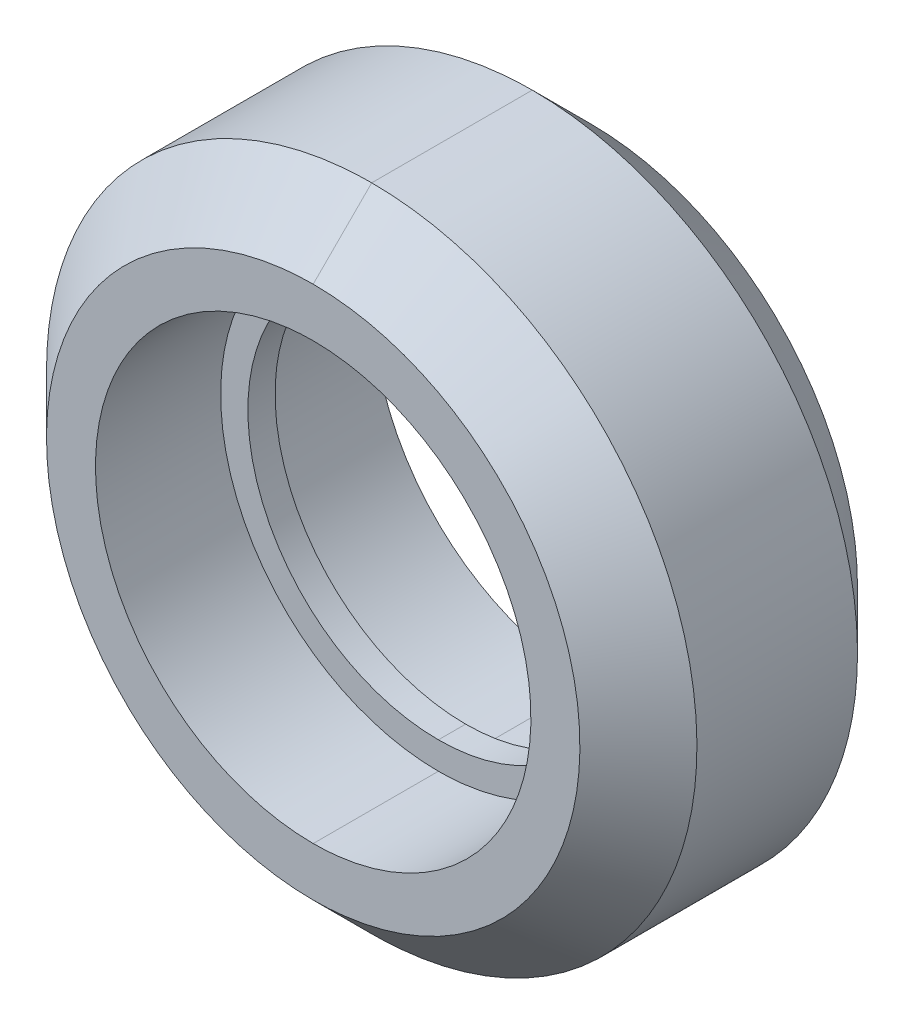
ISO-10303-21;
HEADER;
FILE_DESCRIPTION(('STEP AP214'),'2;1');
FILE_NAME('part.step','',(''),(''),'','','');
FILE_SCHEMA(('AUTOMOTIVE_DESIGN { 1 0 10303 214 1 1 1 1 }'));
ENDSEC;
DATA;
#1=APPLICATION_CONTEXT('core data for automotive mechanical design processes');
#2=APPLICATION_PROTOCOL_DEFINITION('international standard','automotive_design',2000,#1);
#3=PRODUCT_CONTEXT('',#1,'mechanical');
#4=PRODUCT('Part','Part','',(#3));
#5=PRODUCT_RELATED_PRODUCT_CATEGORY('part','',(#4));
#6=PRODUCT_DEFINITION_FORMATION('','',#4);
#7=PRODUCT_DEFINITION_CONTEXT('part definition',#1,'design');
#8=PRODUCT_DEFINITION('design','',#6,#7);
#9=PRODUCT_DEFINITION_SHAPE('','',#8);
#10=(LENGTH_UNIT() NAMED_UNIT(*) SI_UNIT(.MILLI.,.METRE.));
#11=(NAMED_UNIT(*) PLANE_ANGLE_UNIT() SI_UNIT($,.RADIAN.));
#12=(NAMED_UNIT(*) SI_UNIT($,.STERADIAN.) SOLID_ANGLE_UNIT());
#13=UNCERTAINTY_MEASURE_WITH_UNIT(LENGTH_MEASURE(1.E-05),#10,'distance_accuracy_value','');
#14=(GEOMETRIC_REPRESENTATION_CONTEXT(3) GLOBAL_UNCERTAINTY_ASSIGNED_CONTEXT((#13)) GLOBAL_UNIT_ASSIGNED_CONTEXT((#10,
#11,#12)) REPRESENTATION_CONTEXT('',''));
#15=CARTESIAN_POINT('',(0.,0.,0.));
#16=DIRECTION('',(0.,0.,1.));
#17=DIRECTION('',(1.,0.,0.));
#18=AXIS2_PLACEMENT_3D('',#15,#16,#17);
#19=CARTESIAN_POINT('',(209.215281719252,-415.287341556894,254.981305856301));
#20=CARTESIAN_POINT('',(217.215281719252,-415.287341556894,254.981305856301));
#21=CARTESIAN_POINT('',(217.215281719252,-423.287341556894,254.981305856301));
#22=CARTESIAN_POINT('',(217.215281719252,-431.287341556894,254.981305856301));
#23=CARTESIAN_POINT('',(209.215281719252,-431.287341556894,254.981305856301));
#24=CARTESIAN_POINT('',(209.215281719252,-415.287341556894,250.381305856301));
#25=CARTESIAN_POINT('',(217.215281719252,-415.287341556894,250.381305856301));
#26=CARTESIAN_POINT('',(217.215281719252,-423.287341556894,250.381305856301));
#27=CARTESIAN_POINT('',(217.215281719252,-431.287341556894,250.381305856301));
#28=CARTESIAN_POINT('',(209.215281719252,-431.287341556894,250.381305856301));
#29=(BOUNDED_SURFACE() B_SPLINE_SURFACE(1,2,((#19,#20,#21,#22,#23),(#24,#25,#26,#27,#28)),
.UNSPECIFIED.,.F.,.F.,.F.) B_SPLINE_SURFACE_WITH_KNOTS((2,2),(3,2,3),(-5.1,-0.5),
(1.5707963267949,3.14159265358979,4.71238898038469),
.UNSPECIFIED.) GEOMETRIC_REPRESENTATION_ITEM() RATIONAL_B_SPLINE_SURFACE(((1.,0.707106781186548,
1.,0.707106781186548,1.),(1.,0.707106781186548,1.,0.707106781186548,1.))) REPRESENTATION_ITEM('') SURFACE());
#30=CARTESIAN_POINT('',(209.215281719252,-431.287341556894,254.981305856301));
#31=CARTESIAN_POINT('',(209.215281719252,-431.287341556894,250.381305856301));
#32=(BOUNDED_CURVE() B_SPLINE_CURVE(1,(#30,#31),.UNSPECIFIED.,.F.,
.F.) B_SPLINE_CURVE_WITH_KNOTS((2,2),(0.,4.6),
.UNSPECIFIED.) CURVE() GEOMETRIC_REPRESENTATION_ITEM() RATIONAL_B_SPLINE_CURVE((1.,1.)) REPRESENTATION_ITEM(''));
#33=CARTESIAN_POINT('',(209.215281719252,-431.287341556894,254.981305856301));
#34=VERTEX_POINT('',#33);
#35=CARTESIAN_POINT('',(209.215281719252,-431.287341556894,250.381305856301));
#36=VERTEX_POINT('',#35);
#37=EDGE_CURVE('E74',#34,#36,#32,.T.);
#38=CARTESIAN_POINT('',(209.215281719252,-415.287341556894,254.981305856301));
#39=CARTESIAN_POINT('',(217.215281719252,-415.287341556894,254.981305856301));
#40=CARTESIAN_POINT('',(217.215281719252,-423.287341556894,254.981305856301));
#41=CARTESIAN_POINT('',(217.215281719252,-431.287341556894,254.981305856301));
#42=CARTESIAN_POINT('',(209.215281719252,-431.287341556894,254.981305856301));
#43=(BOUNDED_CURVE() B_SPLINE_CURVE(2,(#38,#39,#40,#41,#42),.UNSPECIFIED.,.F.,
.F.) B_SPLINE_CURVE_WITH_KNOTS((3,2,3),(0.,12.5663706143592,25.1327412287183),
.UNSPECIFIED.) CURVE() GEOMETRIC_REPRESENTATION_ITEM() RATIONAL_B_SPLINE_CURVE((1.,
0.707106781186548,1.,0.707106781186548,1.)) REPRESENTATION_ITEM(''));
#44=CARTESIAN_POINT('',(209.215281719252,-415.287341556894,254.981305856301));
#45=VERTEX_POINT('',#44);
#46=EDGE_CURVE('E289',#45,#34,#43,.T.);
#47=CARTESIAN_POINT('',(209.215281719252,-415.287341556894,254.981305856301));
#48=CARTESIAN_POINT('',(209.215281719252,-415.287341556894,250.381305856301));
#49=(BOUNDED_CURVE() B_SPLINE_CURVE(1,(#47,#48),.UNSPECIFIED.,.F.,
.F.) B_SPLINE_CURVE_WITH_KNOTS((2,2),(0.,4.6),
.UNSPECIFIED.) CURVE() GEOMETRIC_REPRESENTATION_ITEM() RATIONAL_B_SPLINE_CURVE((1.,1.)) REPRESENTATION_ITEM(''));
#50=CARTESIAN_POINT('',(209.215281719252,-415.287341556894,250.381305856301));
#51=VERTEX_POINT('',#50);
#52=EDGE_CURVE('E83',#45,#51,#49,.T.);
#53=CARTESIAN_POINT('',(209.215281719252,-415.287341556894,250.381305856301));
#54=CARTESIAN_POINT('',(217.215281719252,-415.287341556894,250.381305856301));
#55=CARTESIAN_POINT('',(217.215281719252,-423.287341556894,250.381305856301));
#56=CARTESIAN_POINT('',(217.215281719252,-431.287341556894,250.381305856301));
#57=CARTESIAN_POINT('',(209.215281719252,-431.287341556894,250.381305856301));
#58=(BOUNDED_CURVE() B_SPLINE_CURVE(2,(#53,#54,#55,#56,#57),.UNSPECIFIED.,.F.,
.F.) B_SPLINE_CURVE_WITH_KNOTS((3,2,3),(0.,12.5663706143592,25.1327412287183),
.UNSPECIFIED.) CURVE() GEOMETRIC_REPRESENTATION_ITEM() RATIONAL_B_SPLINE_CURVE((1.,
0.707106781186548,1.,0.707106781186548,1.)) REPRESENTATION_ITEM(''));
#59=EDGE_CURVE('E162',#51,#36,#58,.T.);
#60=ORIENTED_EDGE('',*,*,#37,.F.);
#61=ORIENTED_EDGE('',*,*,#46,.F.);
#62=ORIENTED_EDGE('',*,*,#52,.T.);
#63=ORIENTED_EDGE('',*,*,#59,.T.);
#64=EDGE_LOOP('',(#60,#61,#62,#63));
#65=FACE_BOUND('',#64,.T.);
#66=ADVANCED_FACE('F51',(#65),#29,.T.);
#67=CARTESIAN_POINT('',(209.215281719252,-413.487341556894,254.981305856301));
#68=CARTESIAN_POINT('',(209.215281719252,-411.337341556894,252.831305856301));
#69=CARTESIAN_POINT('',(219.015281719252,-413.487341556894,254.981305856301));
#70=CARTESIAN_POINT('',(221.165281719252,-411.337341556894,252.831305856301));
#71=CARTESIAN_POINT('',(219.015281719252,-423.287341556894,254.981305856301));
#72=CARTESIAN_POINT('',(221.165281719252,-423.287341556894,252.831305856301));
#73=CARTESIAN_POINT('',(219.015281719252,-433.087341556894,254.981305856301));
#74=CARTESIAN_POINT('',(221.165281719252,-435.237341556894,252.831305856301));
#75=CARTESIAN_POINT('',(209.215281719252,-433.087341556894,254.981305856301));
#76=CARTESIAN_POINT('',(209.215281719252,-435.237341556894,252.831305856301));
#77=(BOUNDED_SURFACE() B_SPLINE_SURFACE(2,1,((#67,#68),(#69,#70),(#71,#72),(#73,#74),(#75,#76)),
.UNSPECIFIED.,.F.,.F.,.F.) B_SPLINE_SURFACE_WITH_KNOTS((3,2,3),(2,2),(1.5707963267949,
3.14159265358979,4.71238898038469),(-3.04055915910215,0.),
.UNSPECIFIED.) GEOMETRIC_REPRESENTATION_ITEM() RATIONAL_B_SPLINE_SURFACE(((1.,1.),
(0.707106781186548,0.707106781186548),(1.,1.),(0.707106781186548,0.707106781186548),(1.,1.))) REPRESENTATION_ITEM('') SURFACE());
#78=CARTESIAN_POINT('',(209.215281719252,-433.087341556894,254.981305856301));
#79=CARTESIAN_POINT('',(209.215281719252,-435.237341556894,252.831305856301));
#80=(BOUNDED_CURVE() B_SPLINE_CURVE(1,(#78,#79),.UNSPECIFIED.,.F.,
.F.) B_SPLINE_CURVE_WITH_KNOTS((2,2),(0.,3.04055915910214),
.UNSPECIFIED.) CURVE() GEOMETRIC_REPRESENTATION_ITEM() RATIONAL_B_SPLINE_CURVE((1.,1.)) REPRESENTATION_ITEM(''));
#81=CARTESIAN_POINT('',(209.215281719252,-433.087341556894,254.981305856301));
#82=VERTEX_POINT('',#81);
#83=CARTESIAN_POINT('',(209.215281719252,-435.237341556894,252.831305856301));
#84=VERTEX_POINT('',#83);
#85=EDGE_CURVE('E377',#82,#84,#80,.T.);
#86=CARTESIAN_POINT('',(209.215281719252,-411.337341556894,252.831305856301));
#87=CARTESIAN_POINT('',(221.165281719252,-411.337341556894,252.831305856301));
#88=CARTESIAN_POINT('',(221.165281719252,-423.287341556894,252.831305856301));
#89=CARTESIAN_POINT('',(221.165281719252,-435.237341556894,252.831305856301));
#90=CARTESIAN_POINT('',(209.215281719252,-435.237341556894,252.831305856301));
#91=(BOUNDED_CURVE() B_SPLINE_CURVE(2,(#86,#87,#88,#89,#90),.UNSPECIFIED.,.F.,
.F.) B_SPLINE_CURVE_WITH_KNOTS((3,2,3),(0.,18.771016105199,37.542032210398),
.UNSPECIFIED.) CURVE() GEOMETRIC_REPRESENTATION_ITEM() RATIONAL_B_SPLINE_CURVE((1.,
0.707106781186548,1.,0.707106781186548,1.)) REPRESENTATION_ITEM(''));
#92=CARTESIAN_POINT('',(209.215281719252,-411.337341556894,252.831305856301));
#93=VERTEX_POINT('',#92);
#94=EDGE_CURVE('E11',#93,#84,#91,.T.);
#95=CARTESIAN_POINT('',(209.215281719252,-413.487341556894,254.981305856301));
#96=CARTESIAN_POINT('',(209.215281719252,-411.337341556894,252.831305856301));
#97=(BOUNDED_CURVE() B_SPLINE_CURVE(1,(#95,#96),.UNSPECIFIED.,.F.,
.F.) B_SPLINE_CURVE_WITH_KNOTS((2,2),(0.,3.04055915910214),
.UNSPECIFIED.) CURVE() GEOMETRIC_REPRESENTATION_ITEM() RATIONAL_B_SPLINE_CURVE((1.,1.)) REPRESENTATION_ITEM(''));
#98=CARTESIAN_POINT('',(209.215281719252,-413.487341556894,254.981305856301));
#99=VERTEX_POINT('',#98);
#100=EDGE_CURVE('E290',#99,#93,#97,.T.);
#101=CARTESIAN_POINT('',(209.215281719252,-413.487341556894,254.981305856301));
#102=CARTESIAN_POINT('',(219.015281719252,-413.487341556894,254.981305856301));
#103=CARTESIAN_POINT('',(219.015281719252,-423.287341556894,254.981305856301));
#104=CARTESIAN_POINT('',(219.015281719252,-433.087341556894,254.981305856301));
#105=CARTESIAN_POINT('',(209.215281719252,-433.087341556894,254.981305856301));
#106=(BOUNDED_CURVE() B_SPLINE_CURVE(2,(#101,#102,#103,#104,#105),.UNSPECIFIED.,.F.,
.F.) B_SPLINE_CURVE_WITH_KNOTS((3,2,3),(0.,15.39380400259,30.78760800518),
.UNSPECIFIED.) CURVE() GEOMETRIC_REPRESENTATION_ITEM() RATIONAL_B_SPLINE_CURVE((1.,
0.707106781186548,1.,0.707106781186548,1.)) REPRESENTATION_ITEM(''));
#107=EDGE_CURVE('E281',#99,#82,#106,.T.);
#108=ORIENTED_EDGE('',*,*,#85,.T.);
#109=ORIENTED_EDGE('',*,*,#94,.F.);
#110=ORIENTED_EDGE('',*,*,#100,.F.);
#111=ORIENTED_EDGE('',*,*,#107,.T.);
#112=EDGE_LOOP('',(#108,#109,#110,#111));
#113=FACE_BOUND('',#112,.T.);
#114=ADVANCED_FACE('F543',(#113),#77,.T.);
#115=CARTESIAN_POINT('',(209.215281719252,-411.337341556894,252.831305856301));
#116=CARTESIAN_POINT('',(209.215281719252,-411.337341556894,246.931305856301));
#117=CARTESIAN_POINT('',(221.165281719252,-411.337341556894,252.831305856301));
#118=CARTESIAN_POINT('',(221.165281719252,-411.337341556894,246.931305856301));
#119=CARTESIAN_POINT('',(221.165281719252,-423.287341556894,252.831305856301));
#120=CARTESIAN_POINT('',(221.165281719252,-423.287341556894,246.931305856301));
#121=CARTESIAN_POINT('',(221.165281719252,-435.237341556894,252.831305856301));
#122=CARTESIAN_POINT('',(221.165281719252,-435.237341556894,246.931305856301));
#123=CARTESIAN_POINT('',(209.215281719252,-435.237341556894,252.831305856301));
#124=CARTESIAN_POINT('',(209.215281719252,-435.237341556894,246.931305856301));
#125=(BOUNDED_SURFACE() B_SPLINE_SURFACE(2,1,((#115,#116),(#117,#118),(#119,#120),(#121,#122),
(#123,#124)),.UNSPECIFIED.,.F.,.F.,.F.) B_SPLINE_SURFACE_WITH_KNOTS((3,2,3),(2,2),
(1.5707963267949,3.14159265358979,4.71238898038469),(-2.95,2.95),
.UNSPECIFIED.) GEOMETRIC_REPRESENTATION_ITEM() RATIONAL_B_SPLINE_SURFACE(((1.,1.),
(0.707106781186547,0.707106781186547),(1.,1.),(0.707106781186547,0.707106781186547),(1.,1.))) REPRESENTATION_ITEM('') SURFACE());
#126=CARTESIAN_POINT('',(209.215281719252,-435.237341556894,252.831305856301));
#127=CARTESIAN_POINT('',(209.215281719252,-435.237341556894,246.931305856301));
#128=(BOUNDED_CURVE() B_SPLINE_CURVE(1,(#126,#127),.UNSPECIFIED.,.F.,
.F.) B_SPLINE_CURVE_WITH_KNOTS((2,2),(0.,5.9),
.UNSPECIFIED.) CURVE() GEOMETRIC_REPRESENTATION_ITEM() RATIONAL_B_SPLINE_CURVE((1.,1.)) REPRESENTATION_ITEM(''));
#129=CARTESIAN_POINT('',(209.215281719252,-435.237341556894,246.931305856301));
#130=VERTEX_POINT('',#129);
#131=EDGE_CURVE('E350',#84,#130,#128,.T.);
#132=CARTESIAN_POINT('',(209.215281719252,-411.337341556894,246.931305856301));
#133=CARTESIAN_POINT('',(221.165281719252,-411.337341556894,246.931305856301));
#134=CARTESIAN_POINT('',(221.165281719252,-423.287341556894,246.931305856301));
#135=CARTESIAN_POINT('',(221.165281719252,-435.237341556894,246.931305856301));
#136=CARTESIAN_POINT('',(209.215281719252,-435.237341556894,246.931305856301));
#137=(BOUNDED_CURVE() B_SPLINE_CURVE(2,(#132,#133,#134,#135,#136),.UNSPECIFIED.,.F.,
.F.) B_SPLINE_CURVE_WITH_KNOTS((3,2,3),(0.,18.771016105199,37.5420322103981),
.UNSPECIFIED.) CURVE() GEOMETRIC_REPRESENTATION_ITEM() RATIONAL_B_SPLINE_CURVE((1.,
0.707106781186547,1.,0.707106781186547,1.)) REPRESENTATION_ITEM(''));
#138=CARTESIAN_POINT('',(209.215281719252,-411.337341556894,246.931305856301));
#139=VERTEX_POINT('',#138);
#140=EDGE_CURVE('E63',#139,#130,#137,.T.);
#141=CARTESIAN_POINT('',(209.215281719252,-411.337341556894,252.831305856301));
#142=CARTESIAN_POINT('',(209.215281719252,-411.337341556894,246.931305856301));
#143=(BOUNDED_CURVE() B_SPLINE_CURVE(1,(#141,#142),.UNSPECIFIED.,.F.,
.F.) B_SPLINE_CURVE_WITH_KNOTS((2,2),(0.,5.9),
.UNSPECIFIED.) CURVE() GEOMETRIC_REPRESENTATION_ITEM() RATIONAL_B_SPLINE_CURVE((1.,1.)) REPRESENTATION_ITEM(''));
#144=EDGE_CURVE('E368',#93,#139,#143,.T.);
#145=ORIENTED_EDGE('',*,*,#131,.T.);
#146=ORIENTED_EDGE('',*,*,#140,.F.);
#147=ORIENTED_EDGE('',*,*,#144,.F.);
#148=ORIENTED_EDGE('',*,*,#94,.T.);
#149=EDGE_LOOP('',(#145,#146,#147,#148));
#150=FACE_BOUND('',#149,.T.);
#151=ADVANCED_FACE('F548',(#150),#125,.T.);
#152=CARTESIAN_POINT('',(209.215281719252,-433.087341556894,244.781305856301));
#153=CARTESIAN_POINT('',(209.215281719252,-435.237341556894,246.931305856301));
#154=CARTESIAN_POINT('',(219.015281719252,-433.087341556894,244.781305856301));
#155=CARTESIAN_POINT('',(221.165281719252,-435.237341556894,246.931305856301));
#156=CARTESIAN_POINT('',(219.015281719252,-423.287341556894,244.781305856301));
#157=CARTESIAN_POINT('',(221.165281719252,-423.287341556894,246.931305856301));
#158=CARTESIAN_POINT('',(219.015281719252,-413.487341556894,244.781305856301));
#159=CARTESIAN_POINT('',(221.165281719252,-411.337341556894,246.931305856301));
#160=CARTESIAN_POINT('',(209.215281719252,-413.487341556894,244.781305856301));
#161=CARTESIAN_POINT('',(209.215281719252,-411.337341556894,246.931305856301));
#162=(BOUNDED_SURFACE() B_SPLINE_SURFACE(2,1,((#152,#153),(#154,#155),(#156,#157),(#158,#159),
(#160,#161)),.UNSPECIFIED.,.F.,.F.,.F.) B_SPLINE_SURFACE_WITH_KNOTS((3,2,3),(2,2),
(1.5707963267949,3.14159265358979,4.71238898038469),(0.,3.04055915910214),
.UNSPECIFIED.) GEOMETRIC_REPRESENTATION_ITEM() RATIONAL_B_SPLINE_SURFACE(((1.,1.),
(0.707106781186548,0.707106781186548),(1.,1.),(0.707106781186548,0.707106781186548),(1.,1.))) REPRESENTATION_ITEM('') SURFACE());
#163=CARTESIAN_POINT('',(209.215281719252,-413.487341556894,244.781305856301));
#164=CARTESIAN_POINT('',(209.215281719252,-411.337341556894,246.931305856301));
#165=(BOUNDED_CURVE() B_SPLINE_CURVE(1,(#163,#164),.UNSPECIFIED.,.F.,
.F.) B_SPLINE_CURVE_WITH_KNOTS((2,2),(0.,3.04055915910214),
.UNSPECIFIED.) CURVE() GEOMETRIC_REPRESENTATION_ITEM() RATIONAL_B_SPLINE_CURVE((1.,1.)) REPRESENTATION_ITEM(''));
#166=CARTESIAN_POINT('',(209.215281719252,-413.487341556894,244.781305856301));
#167=VERTEX_POINT('',#166);
#168=EDGE_CURVE('E323',#167,#139,#165,.T.);
#169=CARTESIAN_POINT('',(209.215281719252,-433.087341556894,244.781305856301));
#170=CARTESIAN_POINT('',(209.215281719252,-435.237341556894,246.931305856301));
#171=(BOUNDED_CURVE() B_SPLINE_CURVE(1,(#169,#170),.UNSPECIFIED.,.F.,
.F.) B_SPLINE_CURVE_WITH_KNOTS((2,2),(0.,3.04055915910212),
.UNSPECIFIED.) CURVE() GEOMETRIC_REPRESENTATION_ITEM() RATIONAL_B_SPLINE_CURVE((1.,1.)) REPRESENTATION_ITEM(''));
#172=CARTESIAN_POINT('',(209.215281719252,-433.087341556894,244.781305856301));
#173=VERTEX_POINT('',#172);
#174=EDGE_CURVE('E332',#173,#130,#171,.T.);
#175=CARTESIAN_POINT('',(209.215281719252,-413.487341556894,244.781305856301));
#176=CARTESIAN_POINT('',(219.015281719252,-413.487341556894,244.781305856301));
#177=CARTESIAN_POINT('',(219.015281719252,-423.287341556894,244.781305856301));
#178=CARTESIAN_POINT('',(219.015281719252,-433.087341556894,244.781305856301));
#179=CARTESIAN_POINT('',(209.215281719252,-433.087341556894,244.781305856301));
#180=(BOUNDED_CURVE() B_SPLINE_CURVE(2,(#175,#176,#177,#178,#179),.UNSPECIFIED.,.F.,
.F.) B_SPLINE_CURVE_WITH_KNOTS((3,2,3),(0.,15.39380400259,30.78760800518),
.UNSPECIFIED.) CURVE() GEOMETRIC_REPRESENTATION_ITEM() RATIONAL_B_SPLINE_CURVE((1.,
0.707106781186548,1.,0.707106781186548,1.)) REPRESENTATION_ITEM(''));
#181=EDGE_CURVE('E211',#167,#173,#180,.T.);
#182=ORIENTED_EDGE('',*,*,#168,.T.);
#183=ORIENTED_EDGE('',*,*,#140,.T.);
#184=ORIENTED_EDGE('',*,*,#174,.F.);
#185=ORIENTED_EDGE('',*,*,#181,.F.);
#186=EDGE_LOOP('',(#182,#183,#184,#185));
#187=FACE_BOUND('',#186,.T.);
#188=ADVANCED_FACE('F555',(#187),#162,.T.);
#189=CARTESIAN_POINT('',(209.215281719252,-415.287341556894,249.381305856301));
#190=CARTESIAN_POINT('',(217.215281719252,-415.287341556894,249.381305856301));
#191=CARTESIAN_POINT('',(217.215281719252,-423.287341556894,249.381305856301));
#192=CARTESIAN_POINT('',(217.215281719252,-431.287341556894,249.381305856301));
#193=CARTESIAN_POINT('',(209.215281719252,-431.287341556894,249.381305856301));
#194=CARTESIAN_POINT('',(209.215281719252,-415.287341556894,244.781305856301));
#195=CARTESIAN_POINT('',(217.215281719252,-415.287341556894,244.781305856301));
#196=CARTESIAN_POINT('',(217.215281719252,-423.287341556894,244.781305856301));
#197=CARTESIAN_POINT('',(217.215281719252,-431.287341556894,244.781305856301));
#198=CARTESIAN_POINT('',(209.215281719252,-431.287341556894,244.781305856301));
#199=(BOUNDED_SURFACE() B_SPLINE_SURFACE(1,2,((#189,#190,#191,#192,#193),(#194,#195,#196,#197,
#198)),.UNSPECIFIED.,.F.,.F.,.F.) B_SPLINE_SURFACE_WITH_KNOTS((2,2),(3,2,3),(0.5,5.1),
(1.5707963267949,3.14159265358979,4.71238898038469),
.UNSPECIFIED.) GEOMETRIC_REPRESENTATION_ITEM() RATIONAL_B_SPLINE_SURFACE(((1.,0.707106781186548,
1.,0.707106781186548,1.),(1.,0.707106781186548,1.,0.707106781186548,1.))) REPRESENTATION_ITEM('') SURFACE());
#200=CARTESIAN_POINT('',(209.215281719252,-431.287341556894,249.381305856301));
#201=CARTESIAN_POINT('',(209.215281719252,-431.287341556894,244.781305856301));
#202=(BOUNDED_CURVE() B_SPLINE_CURVE(1,(#200,#201),.UNSPECIFIED.,.F.,
.F.) B_SPLINE_CURVE_WITH_KNOTS((2,2),(0.,4.6),
.UNSPECIFIED.) CURVE() GEOMETRIC_REPRESENTATION_ITEM() RATIONAL_B_SPLINE_CURVE((1.,1.)) REPRESENTATION_ITEM(''));
#203=CARTESIAN_POINT('',(209.215281719252,-431.287341556894,249.381305856301));
#204=VERTEX_POINT('',#203);
#205=CARTESIAN_POINT('',(209.215281719252,-431.287341556894,244.781305856301));
#206=VERTEX_POINT('',#205);
#207=EDGE_CURVE('E271',#204,#206,#202,.T.);
#208=CARTESIAN_POINT('',(209.215281719252,-415.287341556894,249.381305856301));
#209=CARTESIAN_POINT('',(217.215281719252,-415.287341556894,249.381305856301));
#210=CARTESIAN_POINT('',(217.215281719252,-423.287341556894,249.381305856301));
#211=CARTESIAN_POINT('',(217.215281719252,-431.287341556894,249.381305856301));
#212=CARTESIAN_POINT('',(209.215281719252,-431.287341556894,249.381305856301));
#213=(BOUNDED_CURVE() B_SPLINE_CURVE(2,(#208,#209,#210,#211,#212),.UNSPECIFIED.,.F.,
.F.) B_SPLINE_CURVE_WITH_KNOTS((3,2,3),(0.,12.5663706143592,25.1327412287183),
.UNSPECIFIED.) CURVE() GEOMETRIC_REPRESENTATION_ITEM() RATIONAL_B_SPLINE_CURVE((1.,
0.707106781186548,1.,0.707106781186548,1.)) REPRESENTATION_ITEM(''));
#214=CARTESIAN_POINT('',(209.215281719252,-415.287341556894,249.381305856301));
#215=VERTEX_POINT('',#214);
#216=EDGE_CURVE('E238',#215,#204,#213,.T.);
#217=CARTESIAN_POINT('',(209.215281719252,-415.287341556894,249.381305856301));
#218=CARTESIAN_POINT('',(209.215281719252,-415.287341556894,244.781305856301));
#219=(BOUNDED_CURVE() B_SPLINE_CURVE(1,(#217,#218),.UNSPECIFIED.,.F.,
.F.) B_SPLINE_CURVE_WITH_KNOTS((2,2),(0.,4.6),
.UNSPECIFIED.) CURVE() GEOMETRIC_REPRESENTATION_ITEM() RATIONAL_B_SPLINE_CURVE((1.,1.)) REPRESENTATION_ITEM(''));
#220=CARTESIAN_POINT('',(209.215281719252,-415.287341556894,244.781305856301));
#221=VERTEX_POINT('',#220);
#222=EDGE_CURVE('E299',#215,#221,#219,.T.);
#223=CARTESIAN_POINT('',(209.215281719252,-415.287341556894,244.781305856301));
#224=CARTESIAN_POINT('',(217.215281719252,-415.287341556894,244.781305856301));
#225=CARTESIAN_POINT('',(217.215281719252,-423.287341556894,244.781305856301));
#226=CARTESIAN_POINT('',(217.215281719252,-431.287341556894,244.781305856301));
#227=CARTESIAN_POINT('',(209.215281719252,-431.287341556894,244.781305856301));
#228=(BOUNDED_CURVE() B_SPLINE_CURVE(2,(#223,#224,#225,#226,#227),.UNSPECIFIED.,.F.,
.F.) B_SPLINE_CURVE_WITH_KNOTS((3,2,3),(0.,12.5663706143592,25.1327412287184),
.UNSPECIFIED.) CURVE() GEOMETRIC_REPRESENTATION_ITEM() RATIONAL_B_SPLINE_CURVE((1.,
0.707106781186548,1.,0.707106781186548,1.)) REPRESENTATION_ITEM(''));
#229=EDGE_CURVE('E175',#221,#206,#228,.T.);
#230=ORIENTED_EDGE('',*,*,#207,.F.);
#231=ORIENTED_EDGE('',*,*,#216,.F.);
#232=ORIENTED_EDGE('',*,*,#222,.T.);
#233=ORIENTED_EDGE('',*,*,#229,.T.);
#234=EDGE_LOOP('',(#230,#231,#232,#233));
#235=FACE_BOUND('',#234,.T.);
#236=ADVANCED_FACE('F518',(#235),#199,.T.);
#237=CARTESIAN_POINT('',(209.215281719252,-416.287341556894,250.381305856301));
#238=CARTESIAN_POINT('',(216.215281719252,-416.287341556894,250.381305856301));
#239=CARTESIAN_POINT('',(216.215281719252,-423.287341556894,250.381305856301));
#240=CARTESIAN_POINT('',(216.215281719252,-430.287341556894,250.381305856301));
#241=CARTESIAN_POINT('',(209.215281719252,-430.287341556894,250.381305856301));
#242=CARTESIAN_POINT('',(209.215281719252,-416.287341556894,249.381305856301));
#243=CARTESIAN_POINT('',(216.215281719252,-416.287341556894,249.381305856301));
#244=CARTESIAN_POINT('',(216.215281719252,-423.287341556894,249.381305856301));
#245=CARTESIAN_POINT('',(216.215281719252,-430.287341556894,249.381305856301));
#246=CARTESIAN_POINT('',(209.215281719252,-430.287341556894,249.381305856301));
#247=(BOUNDED_SURFACE() B_SPLINE_SURFACE(1,2,((#237,#238,#239,#240,#241),(#242,#243,#244,#245,
#246)),.UNSPECIFIED.,.F.,.F.,.F.) B_SPLINE_SURFACE_WITH_KNOTS((2,2),(3,2,3),(-0.5,0.5),
(1.5707963267949,3.14159265358979,4.71238898038469),
.UNSPECIFIED.) GEOMETRIC_REPRESENTATION_ITEM() RATIONAL_B_SPLINE_SURFACE(((1.,0.707106781186548,
1.,0.707106781186548,1.),(1.,0.707106781186548,1.,0.707106781186548,1.))) REPRESENTATION_ITEM('') SURFACE());
#248=CARTESIAN_POINT('',(209.215281719252,-430.287341556894,250.381305856301));
#249=CARTESIAN_POINT('',(209.215281719252,-430.287341556894,249.381305856301));
#250=(BOUNDED_CURVE() B_SPLINE_CURVE(1,(#248,#249),.UNSPECIFIED.,.F.,
.F.) B_SPLINE_CURVE_WITH_KNOTS((2,2),(0.,1.),
.UNSPECIFIED.) CURVE() GEOMETRIC_REPRESENTATION_ITEM() RATIONAL_B_SPLINE_CURVE((1.,1.)) REPRESENTATION_ITEM(''));
#251=CARTESIAN_POINT('',(209.215281719252,-430.287341556894,250.381305856301));
#252=VERTEX_POINT('',#251);
#253=CARTESIAN_POINT('',(209.215281719252,-430.287341556894,249.381305856301));
#254=VERTEX_POINT('',#253);
#255=EDGE_CURVE('E201',#252,#254,#250,.T.);
#256=CARTESIAN_POINT('',(209.215281719252,-416.287341556894,250.381305856301));
#257=CARTESIAN_POINT('',(216.215281719252,-416.287341556894,250.381305856301));
#258=CARTESIAN_POINT('',(216.215281719252,-423.287341556894,250.381305856301));
#259=CARTESIAN_POINT('',(216.215281719252,-430.287341556894,250.381305856301));
#260=CARTESIAN_POINT('',(209.215281719252,-430.287341556894,250.381305856301));
#261=(BOUNDED_CURVE() B_SPLINE_CURVE(2,(#256,#257,#258,#259,#260),.UNSPECIFIED.,.F.,
.F.) B_SPLINE_CURVE_WITH_KNOTS((3,2,3),(0.,10.9955742875643,21.9911485751286),
.UNSPECIFIED.) CURVE() GEOMETRIC_REPRESENTATION_ITEM() RATIONAL_B_SPLINE_CURVE((1.,
0.707106781186548,1.,0.707106781186548,1.)) REPRESENTATION_ITEM(''));
#262=CARTESIAN_POINT('',(209.215281719252,-416.287341556894,250.381305856301));
#263=VERTEX_POINT('',#262);
#264=EDGE_CURVE('E165',#263,#252,#261,.T.);
#265=CARTESIAN_POINT('',(209.215281719252,-416.287341556894,250.381305856301));
#266=CARTESIAN_POINT('',(209.215281719252,-416.287341556894,249.381305856301));
#267=(BOUNDED_CURVE() B_SPLINE_CURVE(1,(#265,#266),.UNSPECIFIED.,.F.,
.F.) B_SPLINE_CURVE_WITH_KNOTS((2,2),(0.,1.),
.UNSPECIFIED.) CURVE() GEOMETRIC_REPRESENTATION_ITEM() RATIONAL_B_SPLINE_CURVE((1.,1.)) REPRESENTATION_ITEM(''));
#268=CARTESIAN_POINT('',(209.215281719252,-416.287341556894,249.381305856301));
#269=VERTEX_POINT('',#268);
#270=EDGE_CURVE('E229',#263,#269,#267,.T.);
#271=CARTESIAN_POINT('',(209.215281719252,-416.287341556894,249.381305856301));
#272=CARTESIAN_POINT('',(216.215281719252,-416.287341556894,249.381305856301));
#273=CARTESIAN_POINT('',(216.215281719252,-423.287341556894,249.381305856301));
#274=CARTESIAN_POINT('',(216.215281719252,-430.287341556894,249.381305856301));
#275=CARTESIAN_POINT('',(209.215281719252,-430.287341556894,249.381305856301));
#276=(BOUNDED_CURVE() B_SPLINE_CURVE(2,(#271,#272,#273,#274,#275),.UNSPECIFIED.,.F.,
.F.) B_SPLINE_CURVE_WITH_KNOTS((3,2,3),(0.,10.9955742875643,21.9911485751286),
.UNSPECIFIED.) CURVE() GEOMETRIC_REPRESENTATION_ITEM() RATIONAL_B_SPLINE_CURVE((1.,
0.707106781186548,1.,0.707106781186548,1.)) REPRESENTATION_ITEM(''));
#277=EDGE_CURVE('E256',#269,#254,#276,.T.);
#278=ORIENTED_EDGE('',*,*,#255,.F.);
#279=ORIENTED_EDGE('',*,*,#264,.F.);
#280=ORIENTED_EDGE('',*,*,#270,.T.);
#281=ORIENTED_EDGE('',*,*,#277,.T.);
#282=EDGE_LOOP('',(#278,#279,#280,#281));
#283=FACE_BOUND('',#282,.T.);
#284=ADVANCED_FACE('F572',(#283),#247,.T.);
#285=CARTESIAN_POINT('',(209.215281719252,-431.287341556894,254.981305856301));
#286=CARTESIAN_POINT('',(201.215281719252,-431.287341556894,254.981305856301));
#287=CARTESIAN_POINT('',(201.215281719252,-423.287341556894,254.981305856301));
#288=CARTESIAN_POINT('',(201.215281719252,-415.287341556894,254.981305856301));
#289=CARTESIAN_POINT('',(209.215281719252,-415.287341556894,254.981305856301));
#290=CARTESIAN_POINT('',(209.215281719252,-431.287341556894,250.381305856301));
#291=CARTESIAN_POINT('',(201.215281719252,-431.287341556894,250.381305856301));
#292=CARTESIAN_POINT('',(201.215281719252,-423.287341556894,250.381305856301));
#293=CARTESIAN_POINT('',(201.215281719252,-415.287341556894,250.381305856301));
#294=CARTESIAN_POINT('',(209.215281719252,-415.287341556894,250.381305856301));
#295=(BOUNDED_SURFACE() B_SPLINE_SURFACE(1,2,((#285,#286,#287,#288,#289),(#290,#291,#292,#293,
#294)),.UNSPECIFIED.,.F.,.F.,.F.) B_SPLINE_SURFACE_WITH_KNOTS((2,2),(3,2,3),(-5.1,-0.5),
(1.5707963267949,3.14159265358979,4.71238898038469),
.UNSPECIFIED.) GEOMETRIC_REPRESENTATION_ITEM() RATIONAL_B_SPLINE_SURFACE(((1.,0.707106781186548,
1.,0.707106781186548,1.),(1.,0.707106781186548,1.,0.707106781186548,1.))) REPRESENTATION_ITEM('') SURFACE());
#296=CARTESIAN_POINT('',(209.215281719252,-431.287341556894,250.381305856301));
#297=CARTESIAN_POINT('',(201.215281719252,-431.287341556894,250.381305856301));
#298=CARTESIAN_POINT('',(201.215281719252,-423.287341556894,250.381305856301));
#299=CARTESIAN_POINT('',(201.215281719252,-415.287341556894,250.381305856301));
#300=CARTESIAN_POINT('',(209.215281719252,-415.287341556894,250.381305856301));
#301=(BOUNDED_CURVE() B_SPLINE_CURVE(2,(#296,#297,#298,#299,#300),.UNSPECIFIED.,.F.,
.F.) B_SPLINE_CURVE_WITH_KNOTS((3,2,3),(0.,12.5663706143592,25.1327412287183),
.UNSPECIFIED.) CURVE() GEOMETRIC_REPRESENTATION_ITEM() RATIONAL_B_SPLINE_CURVE((1.,
0.707106781186548,1.,0.707106781186548,1.)) REPRESENTATION_ITEM(''));
#302=EDGE_CURVE('E156',#36,#51,#301,.T.);
#303=CARTESIAN_POINT('',(209.215281719252,-431.287341556894,254.981305856301));
#304=CARTESIAN_POINT('',(201.215281719252,-431.287341556894,254.981305856301));
#305=CARTESIAN_POINT('',(201.215281719252,-423.287341556894,254.981305856301));
#306=CARTESIAN_POINT('',(201.215281719252,-415.287341556894,254.981305856301));
#307=CARTESIAN_POINT('',(209.215281719252,-415.287341556894,254.981305856301));
#308=(BOUNDED_CURVE() B_SPLINE_CURVE(2,(#303,#304,#305,#306,#307),.UNSPECIFIED.,.F.,
.F.) B_SPLINE_CURVE_WITH_KNOTS((3,2,3),(0.,12.5663706143592,25.1327412287183),
.UNSPECIFIED.) CURVE() GEOMETRIC_REPRESENTATION_ITEM() RATIONAL_B_SPLINE_CURVE((1.,
0.707106781186548,1.,0.707106781186548,1.)) REPRESENTATION_ITEM(''));
#309=EDGE_CURVE('E157',#34,#45,#308,.T.);
#310=ORIENTED_EDGE('',*,*,#37,.T.);
#311=ORIENTED_EDGE('',*,*,#302,.T.);
#312=ORIENTED_EDGE('',*,*,#52,.F.);
#313=ORIENTED_EDGE('',*,*,#309,.F.);
#314=EDGE_LOOP('',(#310,#311,#312,#313));
#315=FACE_BOUND('',#314,.T.);
#316=ADVANCED_FACE('F154',(#315),#295,.T.);
#317=CARTESIAN_POINT('',(199.415281719252,-413.487341556894,254.981305856301));
#318=DIRECTION('',(0.,0.,1.));
#319=DIRECTION('',(1.,0.,0.));
#320=AXIS2_PLACEMENT_3D('',#317,#318,#319);
#321=PLANE('',#320);
#322=ORIENTED_EDGE('',*,*,#46,.T.);
#323=ORIENTED_EDGE('',*,*,#309,.T.);
#324=EDGE_LOOP('',(#322,#323));
#325=FACE_BOUND('',#324,.T.);
#326=CARTESIAN_POINT('',(209.215281719252,-433.087341556894,254.981305856301));
#327=CARTESIAN_POINT('',(199.415281719252,-433.087341556894,254.981305856301));
#328=CARTESIAN_POINT('',(199.415281719252,-423.287341556894,254.981305856301));
#329=CARTESIAN_POINT('',(199.415281719252,-413.487341556894,254.981305856301));
#330=CARTESIAN_POINT('',(209.215281719252,-413.487341556894,254.981305856301));
#331=(BOUNDED_CURVE() B_SPLINE_CURVE(2,(#326,#327,#328,#329,#330),.UNSPECIFIED.,.F.,
.F.) B_SPLINE_CURVE_WITH_KNOTS((3,2,3),(0.,15.39380400259,30.78760800518),
.UNSPECIFIED.) CURVE() GEOMETRIC_REPRESENTATION_ITEM() RATIONAL_B_SPLINE_CURVE((1.,
0.707106781186548,1.,0.707106781186548,1.)) REPRESENTATION_ITEM(''));
#332=EDGE_CURVE('E386',#82,#99,#331,.T.);
#333=ORIENTED_EDGE('',*,*,#332,.F.);
#334=ORIENTED_EDGE('',*,*,#107,.F.);
#335=EDGE_LOOP('',(#333,#334));
#336=FACE_BOUND('',#335,.T.);
#337=ADVANCED_FACE('F580',(#325,#336),#321,.T.);
#338=CARTESIAN_POINT('',(209.215281719252,-433.087341556894,254.981305856301));
#339=CARTESIAN_POINT('',(209.215281719252,-435.237341556894,252.831305856301));
#340=CARTESIAN_POINT('',(199.415281719252,-433.087341556894,254.981305856301));
#341=CARTESIAN_POINT('',(197.265281719252,-435.237341556894,252.831305856301));
#342=CARTESIAN_POINT('',(199.415281719252,-423.287341556894,254.981305856301));
#343=CARTESIAN_POINT('',(197.265281719252,-423.287341556894,252.831305856301));
#344=CARTESIAN_POINT('',(199.415281719252,-413.487341556893,254.981305856301));
#345=CARTESIAN_POINT('',(197.265281719252,-411.337341556893,252.831305856301));
#346=CARTESIAN_POINT('',(209.215281719252,-413.487341556894,254.981305856301));
#347=CARTESIAN_POINT('',(209.215281719252,-411.337341556894,252.831305856301));
#348=(BOUNDED_SURFACE() B_SPLINE_SURFACE(2,1,((#338,#339),(#340,#341),(#342,#343),(#344,#345),
(#346,#347)),.UNSPECIFIED.,.F.,.F.,.F.) B_SPLINE_SURFACE_WITH_KNOTS((3,2,3),(2,2),
(1.57079632679488,3.14159265358979,4.71238898038471),(-3.04055915910215,0.),
.UNSPECIFIED.) GEOMETRIC_REPRESENTATION_ITEM() RATIONAL_B_SPLINE_SURFACE(((1.,1.),
(0.707106781186541,0.707106781186541),(1.,1.),(0.707106781186541,0.707106781186541),(1.,1.))) REPRESENTATION_ITEM('') SURFACE());
#349=CARTESIAN_POINT('',(209.215281719252,-435.237341556894,252.831305856301));
#350=CARTESIAN_POINT('',(197.265281719252,-435.237341556894,252.831305856301));
#351=CARTESIAN_POINT('',(197.265281719252,-423.287341556894,252.831305856301));
#352=CARTESIAN_POINT('',(197.265281719252,-411.337341556894,252.831305856301));
#353=CARTESIAN_POINT('',(209.215281719252,-411.337341556894,252.831305856301));
#354=(BOUNDED_CURVE() B_SPLINE_CURVE(2,(#349,#350,#351,#352,#353),.UNSPECIFIED.,.F.,
.F.) B_SPLINE_CURVE_WITH_KNOTS((3,2,3),(0.,18.771016105199,37.542032210398),
.UNSPECIFIED.) CURVE() GEOMETRIC_REPRESENTATION_ITEM() RATIONAL_B_SPLINE_CURVE((1.,
0.707106781186548,1.,0.707106781186548,1.)) REPRESENTATION_ITEM(''));
#355=EDGE_CURVE('E359',#84,#93,#354,.T.);
#356=ORIENTED_EDGE('',*,*,#85,.F.);
#357=ORIENTED_EDGE('',*,*,#332,.T.);
#358=ORIENTED_EDGE('',*,*,#100,.T.);
#359=ORIENTED_EDGE('',*,*,#355,.F.);
#360=EDGE_LOOP('',(#356,#357,#358,#359));
#361=FACE_BOUND('',#360,.T.);
#362=ADVANCED_FACE('F647',(#361),#348,.T.);
#363=CARTESIAN_POINT('',(209.215281719252,-435.237341556894,252.831305856301));
#364=CARTESIAN_POINT('',(209.215281719252,-435.237341556894,246.931305856301));
#365=CARTESIAN_POINT('',(197.265281719252,-435.237341556894,252.831305856301));
#366=CARTESIAN_POINT('',(197.265281719252,-435.237341556894,246.931305856301));
#367=CARTESIAN_POINT('',(197.265281719252,-423.287341556894,252.831305856301));
#368=CARTESIAN_POINT('',(197.265281719252,-423.287341556894,246.931305856301));
#369=CARTESIAN_POINT('',(197.265281719252,-411.337341556894,252.831305856301));
#370=CARTESIAN_POINT('',(197.265281719252,-411.337341556894,246.931305856301));
#371=CARTESIAN_POINT('',(209.215281719252,-411.337341556894,252.831305856301));
#372=CARTESIAN_POINT('',(209.215281719252,-411.337341556894,246.931305856301));
#373=(BOUNDED_SURFACE() B_SPLINE_SURFACE(2,1,((#363,#364),(#365,#366),(#367,#368),(#369,#370),
(#371,#372)),.UNSPECIFIED.,.F.,.F.,.F.) B_SPLINE_SURFACE_WITH_KNOTS((3,2,3),(2,2),
(1.5707963267949,3.14159265358979,4.71238898038469),(-2.95,2.95),
.UNSPECIFIED.) GEOMETRIC_REPRESENTATION_ITEM() RATIONAL_B_SPLINE_SURFACE(((1.,1.),
(0.707106781186547,0.707106781186547),(1.,1.),(0.707106781186547,0.707106781186547),(1.,1.))) REPRESENTATION_ITEM('') SURFACE());
#374=CARTESIAN_POINT('',(209.215281719252,-435.237341556894,246.931305856301));
#375=CARTESIAN_POINT('',(197.265281719252,-435.237341556894,246.931305856301));
#376=CARTESIAN_POINT('',(197.265281719252,-423.287341556894,246.931305856301));
#377=CARTESIAN_POINT('',(197.265281719252,-411.337341556894,246.931305856301));
#378=CARTESIAN_POINT('',(209.215281719252,-411.337341556894,246.931305856301));
#379=(BOUNDED_CURVE() B_SPLINE_CURVE(2,(#374,#375,#376,#377,#378),.UNSPECIFIED.,.F.,
.F.) B_SPLINE_CURVE_WITH_KNOTS((3,2,3),(0.,18.771016105199,37.542032210398),
.UNSPECIFIED.) CURVE() GEOMETRIC_REPRESENTATION_ITEM() RATIONAL_B_SPLINE_CURVE((1.,
0.707106781186548,1.,0.707106781186548,1.)) REPRESENTATION_ITEM(''));
#380=EDGE_CURVE('E341',#130,#139,#379,.T.);
#381=ORIENTED_EDGE('',*,*,#131,.F.);
#382=ORIENTED_EDGE('',*,*,#355,.T.);
#383=ORIENTED_EDGE('',*,*,#144,.T.);
#384=ORIENTED_EDGE('',*,*,#380,.F.);
#385=EDGE_LOOP('',(#381,#382,#383,#384));
#386=FACE_BOUND('',#385,.T.);
#387=ADVANCED_FACE('F624',(#386),#373,.T.);
#388=CARTESIAN_POINT('',(209.215281719252,-413.487341556894,244.781305856301));
#389=CARTESIAN_POINT('',(209.215281719252,-411.337341556894,246.931305856301));
#390=CARTESIAN_POINT('',(199.415281719252,-413.487341556894,244.781305856301));
#391=CARTESIAN_POINT('',(197.265281719252,-411.337341556894,246.931305856301));
#392=CARTESIAN_POINT('',(199.415281719252,-423.287341556894,244.781305856301));
#393=CARTESIAN_POINT('',(197.265281719252,-423.287341556894,246.931305856301));
#394=CARTESIAN_POINT('',(199.415281719252,-433.087341556894,244.781305856301));
#395=CARTESIAN_POINT('',(197.265281719252,-435.237341556894,246.931305856301));
#396=CARTESIAN_POINT('',(209.215281719252,-433.087341556894,244.781305856301));
#397=CARTESIAN_POINT('',(209.215281719252,-435.237341556894,246.931305856301));
#398=(BOUNDED_SURFACE() B_SPLINE_SURFACE(2,1,((#388,#389),(#390,#391),(#392,#393),(#394,#395),
(#396,#397)),.UNSPECIFIED.,.F.,.F.,.F.) B_SPLINE_SURFACE_WITH_KNOTS((3,2,3),(2,2),
(1.5707963267949,3.14159265358979,4.71238898038469),(0.,3.04055915910214),
.UNSPECIFIED.) GEOMETRIC_REPRESENTATION_ITEM() RATIONAL_B_SPLINE_SURFACE(((1.,1.),
(0.707106781186548,0.707106781186548),(1.,1.),(0.707106781186548,0.707106781186548),(1.,1.))) REPRESENTATION_ITEM('') SURFACE());
#399=CARTESIAN_POINT('',(209.215281719252,-433.087341556894,244.781305856301));
#400=CARTESIAN_POINT('',(199.415281719252,-433.087341556894,244.781305856301));
#401=CARTESIAN_POINT('',(199.415281719252,-423.287341556894,244.781305856301));
#402=CARTESIAN_POINT('',(199.415281719252,-413.487341556894,244.781305856301));
#403=CARTESIAN_POINT('',(209.215281719252,-413.487341556894,244.781305856301));
#404=(BOUNDED_CURVE() B_SPLINE_CURVE(2,(#399,#400,#401,#402,#403),.UNSPECIFIED.,.F.,
.F.) B_SPLINE_CURVE_WITH_KNOTS((3,2,3),(0.,15.39380400259,30.78760800518),
.UNSPECIFIED.) CURVE() GEOMETRIC_REPRESENTATION_ITEM() RATIONAL_B_SPLINE_CURVE((1.,
0.707106781186548,1.,0.707106781186548,1.)) REPRESENTATION_ITEM(''));
#405=EDGE_CURVE('E202',#173,#167,#404,.T.);
#406=ORIENTED_EDGE('',*,*,#168,.F.);
#407=ORIENTED_EDGE('',*,*,#405,.F.);
#408=ORIENTED_EDGE('',*,*,#174,.T.);
#409=ORIENTED_EDGE('',*,*,#380,.T.);
#410=EDGE_LOOP('',(#406,#407,#408,#409));
#411=FACE_BOUND('',#410,.T.);
#412=ADVANCED_FACE('F616',(#411),#398,.T.);
#413=CARTESIAN_POINT('',(199.415281719252,-433.087341556894,244.781305856301));
#414=DIRECTION('',(0.,0.,-1.));
#415=DIRECTION('',(0.,-1.,0.));
#416=AXIS2_PLACEMENT_3D('',#413,#414,#415);
#417=PLANE('',#416);
#418=CARTESIAN_POINT('',(209.215281719252,-431.287341556894,244.781305856301));
#419=CARTESIAN_POINT('',(201.215281719252,-431.287341556894,244.781305856301));
#420=CARTESIAN_POINT('',(201.215281719252,-423.287341556894,244.781305856301));
#421=CARTESIAN_POINT('',(201.215281719252,-415.287341556894,244.781305856301));
#422=CARTESIAN_POINT('',(209.215281719252,-415.287341556894,244.781305856301));
#423=(BOUNDED_CURVE() B_SPLINE_CURVE(2,(#418,#419,#420,#421,#422),.UNSPECIFIED.,.F.,
.F.) B_SPLINE_CURVE_WITH_KNOTS((3,2,3),(0.,12.5663706143592,25.1327412287184),
.UNSPECIFIED.) CURVE() GEOMETRIC_REPRESENTATION_ITEM() RATIONAL_B_SPLINE_CURVE((1.,
0.707106781186548,1.,0.707106781186548,1.)) REPRESENTATION_ITEM(''));
#424=EDGE_CURVE('E280',#206,#221,#423,.T.);
#425=ORIENTED_EDGE('',*,*,#424,.F.);
#426=ORIENTED_EDGE('',*,*,#229,.F.);
#427=EDGE_LOOP('',(#425,#426));
#428=FACE_BOUND('',#427,.T.);
#429=ORIENTED_EDGE('',*,*,#181,.T.);
#430=ORIENTED_EDGE('',*,*,#405,.T.);
#431=EDGE_LOOP('',(#429,#430));
#432=FACE_BOUND('',#431,.T.);
#433=ADVANCED_FACE('F522',(#428,#432),#417,.T.);
#434=CARTESIAN_POINT('',(209.215281719252,-431.287341556894,249.381305856301));
#435=CARTESIAN_POINT('',(201.215281719252,-431.287341556894,249.381305856301));
#436=CARTESIAN_POINT('',(201.215281719252,-423.287341556894,249.381305856301));
#437=CARTESIAN_POINT('',(201.215281719252,-415.287341556894,249.381305856301));
#438=CARTESIAN_POINT('',(209.215281719252,-415.287341556894,249.381305856301));
#439=CARTESIAN_POINT('',(209.215281719252,-431.287341556894,244.781305856301));
#440=CARTESIAN_POINT('',(201.215281719252,-431.287341556894,244.781305856301));
#441=CARTESIAN_POINT('',(201.215281719252,-423.287341556894,244.781305856301));
#442=CARTESIAN_POINT('',(201.215281719252,-415.287341556894,244.781305856301));
#443=CARTESIAN_POINT('',(209.215281719252,-415.287341556894,244.781305856301));
#444=(BOUNDED_SURFACE() B_SPLINE_SURFACE(1,2,((#434,#435,#436,#437,#438),(#439,#440,#441,#442,
#443)),.UNSPECIFIED.,.F.,.F.,.F.) B_SPLINE_SURFACE_WITH_KNOTS((2,2),(3,2,3),(0.5,5.1),
(1.5707963267949,3.14159265358979,4.71238898038469),
.UNSPECIFIED.) GEOMETRIC_REPRESENTATION_ITEM() RATIONAL_B_SPLINE_SURFACE(((1.,0.707106781186548,
1.,0.707106781186548,1.),(1.,0.707106781186548,1.,0.707106781186548,1.))) REPRESENTATION_ITEM('') SURFACE());
#445=CARTESIAN_POINT('',(209.215281719252,-431.287341556894,249.381305856301));
#446=CARTESIAN_POINT('',(201.215281719252,-431.287341556894,249.381305856301));
#447=CARTESIAN_POINT('',(201.215281719252,-423.287341556894,249.381305856301));
#448=CARTESIAN_POINT('',(201.215281719252,-415.287341556894,249.381305856301));
#449=CARTESIAN_POINT('',(209.215281719252,-415.287341556894,249.381305856301));
#450=(BOUNDED_CURVE() B_SPLINE_CURVE(2,(#445,#446,#447,#448,#449),.UNSPECIFIED.,.F.,
.F.) B_SPLINE_CURVE_WITH_KNOTS((3,2,3),(0.,12.5663706143592,25.1327412287183),
.UNSPECIFIED.) CURVE() GEOMETRIC_REPRESENTATION_ITEM() RATIONAL_B_SPLINE_CURVE((1.,
0.707106781186548,1.,0.707106781186548,1.)) REPRESENTATION_ITEM(''));
#451=EDGE_CURVE('E247',#204,#215,#450,.T.);
#452=ORIENTED_EDGE('',*,*,#207,.T.);
#453=ORIENTED_EDGE('',*,*,#424,.T.);
#454=ORIENTED_EDGE('',*,*,#222,.F.);
#455=ORIENTED_EDGE('',*,*,#451,.F.);
#456=EDGE_LOOP('',(#452,#453,#454,#455));
#457=FACE_BOUND('',#456,.T.);
#458=ADVANCED_FACE('F525',(#457),#444,.T.);
#459=CARTESIAN_POINT('',(201.215281719252,-431.287341556894,249.381305856301));
#460=DIRECTION('',(0.,0.,-1.));
#461=DIRECTION('',(0.,-1.,0.));
#462=AXIS2_PLACEMENT_3D('',#459,#460,#461);
#463=PLANE('',#462);
#464=CARTESIAN_POINT('',(209.215281719252,-430.287341556894,249.381305856301));
#465=CARTESIAN_POINT('',(202.215281719252,-430.287341556894,249.381305856301));
#466=CARTESIAN_POINT('',(202.215281719252,-423.287341556894,249.381305856301));
#467=CARTESIAN_POINT('',(202.215281719252,-416.287341556894,249.381305856301));
#468=CARTESIAN_POINT('',(209.215281719252,-416.287341556894,249.381305856301));
#469=(BOUNDED_CURVE() B_SPLINE_CURVE(2,(#464,#465,#466,#467,#468),.UNSPECIFIED.,.F.,
.F.) B_SPLINE_CURVE_WITH_KNOTS((3,2,3),(0.,10.9955742875643,21.9911485751286),
.UNSPECIFIED.) CURVE() GEOMETRIC_REPRESENTATION_ITEM() RATIONAL_B_SPLINE_CURVE((1.,
0.707106781186548,1.,0.707106781186548,1.)) REPRESENTATION_ITEM(''));
#470=EDGE_CURVE('E220',#254,#269,#469,.T.);
#471=ORIENTED_EDGE('',*,*,#470,.F.);
#472=ORIENTED_EDGE('',*,*,#277,.F.);
#473=EDGE_LOOP('',(#471,#472));
#474=FACE_BOUND('',#473,.T.);
#475=ORIENTED_EDGE('',*,*,#216,.T.);
#476=ORIENTED_EDGE('',*,*,#451,.T.);
#477=EDGE_LOOP('',(#475,#476));
#478=FACE_BOUND('',#477,.T.);
#479=ADVANCED_FACE('F527',(#474,#478),#463,.T.);
#480=CARTESIAN_POINT('',(209.215281719252,-430.287341556894,250.381305856301));
#481=CARTESIAN_POINT('',(202.215281719252,-430.287341556894,250.381305856301));
#482=CARTESIAN_POINT('',(202.215281719252,-423.287341556894,250.381305856301));
#483=CARTESIAN_POINT('',(202.215281719252,-416.287341556894,250.381305856301));
#484=CARTESIAN_POINT('',(209.215281719252,-416.287341556894,250.381305856301));
#485=CARTESIAN_POINT('',(209.215281719252,-430.287341556894,249.381305856301));
#486=CARTESIAN_POINT('',(202.215281719252,-430.287341556894,249.381305856301));
#487=CARTESIAN_POINT('',(202.215281719252,-423.287341556894,249.381305856301));
#488=CARTESIAN_POINT('',(202.215281719252,-416.287341556894,249.381305856301));
#489=CARTESIAN_POINT('',(209.215281719252,-416.287341556894,249.381305856301));
#490=(BOUNDED_SURFACE() B_SPLINE_SURFACE(1,2,((#480,#481,#482,#483,#484),(#485,#486,#487,#488,
#489)),.UNSPECIFIED.,.F.,.F.,.F.) B_SPLINE_SURFACE_WITH_KNOTS((2,2),(3,2,3),(-0.5,0.5),
(1.5707963267949,3.14159265358979,4.71238898038469),
.UNSPECIFIED.) GEOMETRIC_REPRESENTATION_ITEM() RATIONAL_B_SPLINE_SURFACE(((1.,0.707106781186548,
1.,0.707106781186548,1.),(1.,0.707106781186548,1.,0.707106781186548,1.))) REPRESENTATION_ITEM('') SURFACE());
#491=CARTESIAN_POINT('',(209.215281719252,-430.287341556894,250.381305856301));
#492=CARTESIAN_POINT('',(202.215281719252,-430.287341556894,250.381305856301));
#493=CARTESIAN_POINT('',(202.215281719252,-423.287341556894,250.381305856301));
#494=CARTESIAN_POINT('',(202.215281719252,-416.287341556894,250.381305856301));
#495=CARTESIAN_POINT('',(209.215281719252,-416.287341556894,250.381305856301));
#496=(BOUNDED_CURVE() B_SPLINE_CURVE(2,(#491,#492,#493,#494,#495),.UNSPECIFIED.,.F.,
.F.) B_SPLINE_CURVE_WITH_KNOTS((3,2,3),(0.,10.9955742875643,21.9911485751286),
.UNSPECIFIED.) CURVE() GEOMETRIC_REPRESENTATION_ITEM() RATIONAL_B_SPLINE_CURVE((1.,
0.707106781186548,1.,0.707106781186548,1.)) REPRESENTATION_ITEM(''));
#497=EDGE_CURVE('E192',#252,#263,#496,.T.);
#498=ORIENTED_EDGE('',*,*,#255,.T.);
#499=ORIENTED_EDGE('',*,*,#470,.T.);
#500=ORIENTED_EDGE('',*,*,#270,.F.);
#501=ORIENTED_EDGE('',*,*,#497,.F.);
#502=EDGE_LOOP('',(#498,#499,#500,#501));
#503=FACE_BOUND('',#502,.T.);
#504=ADVANCED_FACE('F529',(#503),#490,.T.);
#505=CARTESIAN_POINT('',(201.215281719252,-415.287341556894,250.381305856301));
#506=DIRECTION('',(0.,0.,1.));
#507=DIRECTION('',(1.,0.,0.));
#508=AXIS2_PLACEMENT_3D('',#505,#506,#507);
#509=PLANE('',#508);
#510=ORIENTED_EDGE('',*,*,#264,.T.);
#511=ORIENTED_EDGE('',*,*,#497,.T.);
#512=EDGE_LOOP('',(#510,#511));
#513=FACE_BOUND('',#512,.T.);
#514=ORIENTED_EDGE('',*,*,#302,.F.);
#515=ORIENTED_EDGE('',*,*,#59,.F.);
#516=EDGE_LOOP('',(#514,#515));
#517=FACE_BOUND('',#516,.T.);
#518=ADVANCED_FACE('F167',(#513,#517),#509,.T.);
#519=CLOSED_SHELL('',(#66,#114,#151,#188,#236,#284,#316,#337,#362,#387,#412,#433,#458,#479,#504,#518));
#520=MANIFOLD_SOLID_BREP('B2',#519);
#521=ADVANCED_BREP_SHAPE_REPRESENTATION('',(#18,#520),#14);
#522=SHAPE_DEFINITION_REPRESENTATION(#9,#521);
ENDSEC;
END-ISO-10303-21;
